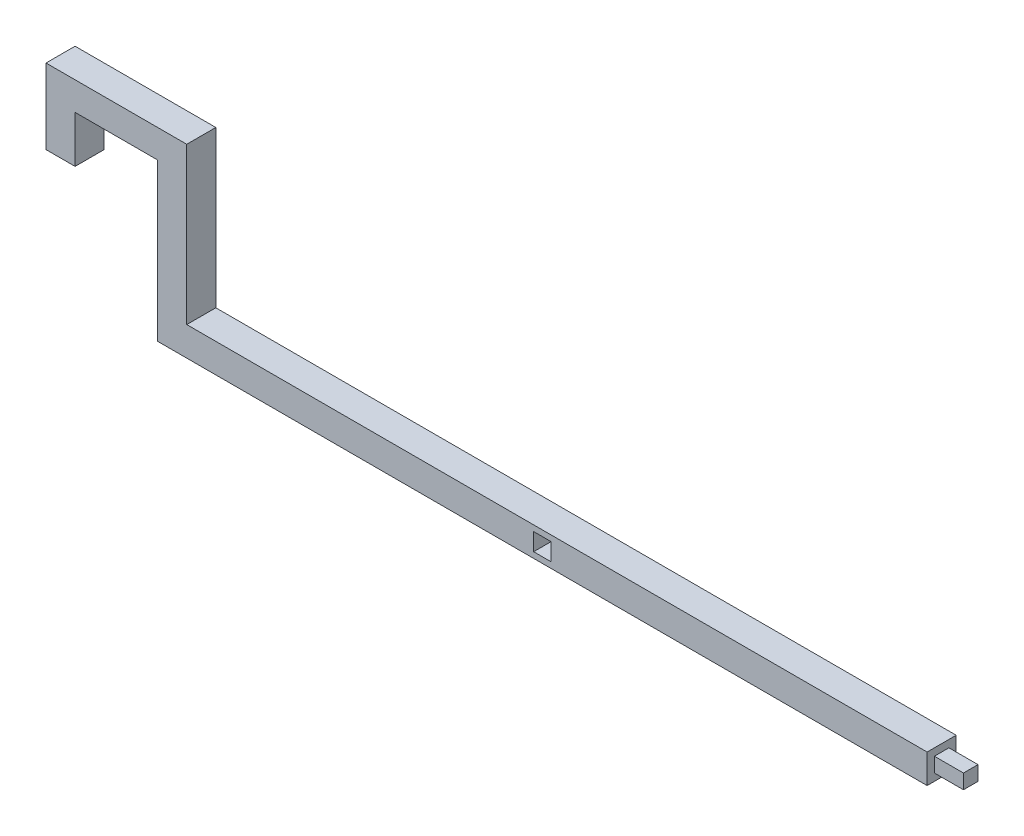
ISO-10303-21;
HEADER;
FILE_DESCRIPTION(('STEP AP214'),'2;1');
FILE_NAME('part.step','',(''),(''),'','','');
FILE_SCHEMA(('AUTOMOTIVE_DESIGN { 1 0 10303 214 1 1 1 1 }'));
ENDSEC;
DATA;
#1=APPLICATION_CONTEXT('core data for automotive mechanical design processes');
#2=APPLICATION_PROTOCOL_DEFINITION('international standard','automotive_design',2000,#1);
#3=PRODUCT_CONTEXT('',#1,'mechanical');
#4=PRODUCT('Part','Part','',(#3));
#5=PRODUCT_RELATED_PRODUCT_CATEGORY('part','',(#4));
#6=PRODUCT_DEFINITION_FORMATION('','',#4);
#7=PRODUCT_DEFINITION_CONTEXT('part definition',#1,'design');
#8=PRODUCT_DEFINITION('design','',#6,#7);
#9=PRODUCT_DEFINITION_SHAPE('','',#8);
#10=(LENGTH_UNIT() NAMED_UNIT(*) SI_UNIT(.MILLI.,.METRE.));
#11=(NAMED_UNIT(*) PLANE_ANGLE_UNIT() SI_UNIT($,.RADIAN.));
#12=(NAMED_UNIT(*) SI_UNIT($,.STERADIAN.) SOLID_ANGLE_UNIT());
#13=UNCERTAINTY_MEASURE_WITH_UNIT(LENGTH_MEASURE(1.E-05),#10,'distance_accuracy_value','');
#14=(GEOMETRIC_REPRESENTATION_CONTEXT(3) GLOBAL_UNCERTAINTY_ASSIGNED_CONTEXT((#13)) GLOBAL_UNIT_ASSIGNED_CONTEXT((#10,
#11,#12)) REPRESENTATION_CONTEXT('',''));
#15=CARTESIAN_POINT('',(0.,0.,0.));
#16=DIRECTION('',(0.,0.,1.));
#17=DIRECTION('',(1.,0.,0.));
#18=AXIS2_PLACEMENT_3D('',#15,#16,#17);
#19=CARTESIAN_POINT('',(146.5,-18.95,5.));
#20=DIRECTION('',(-1.,0.,0.));
#21=DIRECTION('',(0.,0.,1.));
#22=AXIS2_PLACEMENT_3D('',#19,#20,#21);
#23=PLANE('',#22);
#24=DIRECTION('',(0.,1.,0.));
#25=VECTOR('',#24,1.);
#26=CARTESIAN_POINT('',(146.5,-18.95,0.));
#27=LINE('',#26,#25);
#28=CARTESIAN_POINT('',(146.5,-18.95,0.));
#29=VERTEX_POINT('',#28);
#30=CARTESIAN_POINT('',(146.5,-13.95,0.));
#31=VERTEX_POINT('',#30);
#32=EDGE_CURVE('E249',#29,#31,#27,.T.);
#33=ORIENTED_EDGE('',*,*,#32,.T.);
#34=DIRECTION('',(0.,0.,-1.));
#35=VECTOR('',#34,1.);
#36=CARTESIAN_POINT('',(146.5,-13.95,5.));
#37=LINE('',#36,#35);
#38=CARTESIAN_POINT('',(146.5,-13.95,5.));
#39=VERTEX_POINT('',#38);
#40=EDGE_CURVE('E276',#39,#31,#37,.T.);
#41=ORIENTED_EDGE('',*,*,#40,.F.);
#42=DIRECTION('',(0.,1.,0.));
#43=VECTOR('',#42,1.);
#44=CARTESIAN_POINT('',(146.5,-18.95,5.));
#45=LINE('',#44,#43);
#46=CARTESIAN_POINT('',(146.5,-18.95,5.));
#47=VERTEX_POINT('',#46);
#48=EDGE_CURVE('E228',#47,#39,#45,.T.);
#49=ORIENTED_EDGE('',*,*,#48,.F.);
#50=DIRECTION('',(0.,0.,-1.));
#51=VECTOR('',#50,1.);
#52=CARTESIAN_POINT('',(146.5,-18.95,5.));
#53=LINE('',#52,#51);
#54=EDGE_CURVE('E279',#47,#29,#53,.T.);
#55=ORIENTED_EDGE('',*,*,#54,.T.);
#56=EDGE_LOOP('',(#33,#41,#49,#55));
#57=FACE_BOUND('',#56,.T.);
#58=DIRECTION('',(0.,-1.,0.));
#59=VECTOR('',#58,1.);
#60=CARTESIAN_POINT('',(146.5,-17.7,3.75));
#61=LINE('',#60,#59);
#62=CARTESIAN_POINT('',(146.5,-15.2,3.75));
#63=VERTEX_POINT('',#62);
#64=CARTESIAN_POINT('',(146.5,-17.7,3.75));
#65=VERTEX_POINT('',#64);
#66=EDGE_CURVE('E183',#63,#65,#61,.T.);
#67=ORIENTED_EDGE('',*,*,#66,.F.);
#68=DIRECTION('',(0.,0.,1.));
#69=VECTOR('',#68,1.);
#70=CARTESIAN_POINT('',(146.5,-15.2,3.75));
#71=LINE('',#70,#69);
#72=CARTESIAN_POINT('',(146.5,-15.2,1.25));
#73=VERTEX_POINT('',#72);
#74=EDGE_CURVE('E190',#73,#63,#71,.T.);
#75=ORIENTED_EDGE('',*,*,#74,.F.);
#76=DIRECTION('',(0.,1.,0.));
#77=VECTOR('',#76,1.);
#78=CARTESIAN_POINT('',(146.5,-17.7,1.25));
#79=LINE('',#78,#77);
#80=CARTESIAN_POINT('',(146.5,-17.7,1.25));
#81=VERTEX_POINT('',#80);
#82=EDGE_CURVE('E202',#81,#73,#79,.T.);
#83=ORIENTED_EDGE('',*,*,#82,.F.);
#84=DIRECTION('',(0.,0.,-1.));
#85=VECTOR('',#84,1.);
#86=CARTESIAN_POINT('',(146.5,-17.7,3.75));
#87=LINE('',#86,#85);
#88=EDGE_CURVE('E199',#65,#81,#87,.T.);
#89=ORIENTED_EDGE('',*,*,#88,.F.);
#90=EDGE_LOOP('',(#67,#75,#83,#89));
#91=FACE_BOUND('',#90,.T.);
#92=ADVANCED_FACE('F33',(#57,#91),#23,.F.);
#93=CARTESIAN_POINT('',(0.,6.7,5.));
#94=DIRECTION('',(-1.,0.,0.));
#95=DIRECTION('',(0.,0.,1.));
#96=AXIS2_PLACEMENT_3D('',#93,#94,#95);
#97=PLANE('',#96);
#98=DIRECTION('',(0.,1.,0.));
#99=VECTOR('',#98,1.);
#100=CARTESIAN_POINT('',(0.,6.7,0.));
#101=LINE('',#100,#99);
#102=CARTESIAN_POINT('',(0.,0.,0.));
#103=VERTEX_POINT('',#102);
#104=CARTESIAN_POINT('',(0.,8.05,0.));
#105=VERTEX_POINT('',#104);
#106=EDGE_CURVE('E218',#103,#105,#101,.T.);
#107=ORIENTED_EDGE('',*,*,#106,.T.);
#108=DIRECTION('',(0.,0.,-1.));
#109=VECTOR('',#108,1.);
#110=CARTESIAN_POINT('',(0.,8.05,5.));
#111=LINE('',#110,#109);
#112=CARTESIAN_POINT('',(0.,8.05,5.));
#113=VERTEX_POINT('',#112);
#114=EDGE_CURVE('E288',#113,#105,#111,.T.);
#115=ORIENTED_EDGE('',*,*,#114,.F.);
#116=DIRECTION('',(0.,1.,0.));
#117=VECTOR('',#116,1.);
#118=CARTESIAN_POINT('',(0.,6.7,5.));
#119=LINE('',#118,#117);
#120=CARTESIAN_POINT('',(0.,0.,5.));
#121=VERTEX_POINT('',#120);
#122=EDGE_CURVE('E219',#121,#113,#119,.T.);
#123=ORIENTED_EDGE('',*,*,#122,.F.);
#124=DIRECTION('',(0.,0.,-1.));
#125=VECTOR('',#124,1.);
#126=CARTESIAN_POINT('',(0.,0.,5.));
#127=LINE('',#126,#125);
#128=EDGE_CURVE('E240',#121,#103,#127,.T.);
#129=ORIENTED_EDGE('',*,*,#128,.T.);
#130=EDGE_LOOP('',(#107,#115,#123,#129));
#131=FACE_BOUND('',#130,.T.);
#132=ADVANCED_FACE('F35',(#131),#97,.F.);
#133=CARTESIAN_POINT('',(5.5,8.05,5.));
#134=DIRECTION('',(0.,1.,0.));
#135=DIRECTION('',(0.,0.,1.));
#136=AXIS2_PLACEMENT_3D('',#133,#134,#135);
#137=PLANE('',#136);
#138=DIRECTION('',(1.,0.,0.));
#139=VECTOR('',#138,1.);
#140=CARTESIAN_POINT('',(5.5,8.05,0.));
#141=LINE('',#140,#139);
#142=CARTESIAN_POINT('',(14.2,8.05,0.));
#143=VERTEX_POINT('',#142);
#144=EDGE_CURVE('E243',#105,#143,#141,.T.);
#145=ORIENTED_EDGE('',*,*,#144,.T.);
#146=DIRECTION('',(0.,0.,-1.));
#147=VECTOR('',#146,1.);
#148=CARTESIAN_POINT('',(14.2,8.05,5.));
#149=LINE('',#148,#147);
#150=CARTESIAN_POINT('',(14.2,8.05,5.));
#151=VERTEX_POINT('',#150);
#152=EDGE_CURVE('E285',#151,#143,#149,.T.);
#153=ORIENTED_EDGE('',*,*,#152,.F.);
#154=DIRECTION('',(1.,0.,0.));
#155=VECTOR('',#154,1.);
#156=CARTESIAN_POINT('',(0.,8.05,5.));
#157=LINE('',#156,#155);
#158=EDGE_CURVE('E221',#113,#151,#157,.T.);
#159=ORIENTED_EDGE('',*,*,#158,.F.);
#160=ORIENTED_EDGE('',*,*,#114,.T.);
#161=EDGE_LOOP('',(#145,#153,#159,#160));
#162=FACE_BOUND('',#161,.T.);
#163=ADVANCED_FACE('F322',(#162),#137,.F.);
#164=CARTESIAN_POINT('',(14.2,8.05,5.));
#165=DIRECTION('',(1.,0.,0.));
#166=DIRECTION('',(0.,1.,0.));
#167=AXIS2_PLACEMENT_3D('',#164,#165,#166);
#168=PLANE('',#167);
#169=DIRECTION('',(0.,-1.,0.));
#170=VECTOR('',#169,1.);
#171=CARTESIAN_POINT('',(14.2,8.05,0.));
#172=LINE('',#171,#170);
#173=CARTESIAN_POINT('',(14.2,-18.95,0.));
#174=VERTEX_POINT('',#173);
#175=EDGE_CURVE('E245',#143,#174,#172,.T.);
#176=ORIENTED_EDGE('',*,*,#175,.T.);
#177=DIRECTION('',(0.,0.,-1.));
#178=VECTOR('',#177,1.);
#179=CARTESIAN_POINT('',(14.2,-18.95,5.));
#180=LINE('',#179,#178);
#181=CARTESIAN_POINT('',(14.2,-18.95,5.));
#182=VERTEX_POINT('',#181);
#183=EDGE_CURVE('E282',#182,#174,#180,.T.);
#184=ORIENTED_EDGE('',*,*,#183,.F.);
#185=DIRECTION('',(0.,-1.,0.));
#186=VECTOR('',#185,1.);
#187=CARTESIAN_POINT('',(14.2,8.05,5.));
#188=LINE('',#187,#186);
#189=EDGE_CURVE('E224',#151,#182,#188,.T.);
#190=ORIENTED_EDGE('',*,*,#189,.F.);
#191=ORIENTED_EDGE('',*,*,#152,.T.);
#192=EDGE_LOOP('',(#176,#184,#190,#191));
#193=FACE_BOUND('',#192,.T.);
#194=ADVANCED_FACE('F332',(#193),#168,.F.);
#195=CARTESIAN_POINT('',(14.2,-18.95,5.));
#196=DIRECTION('',(0.,1.,0.));
#197=DIRECTION('',(-1.,0.,0.));
#198=AXIS2_PLACEMENT_3D('',#195,#196,#197);
#199=PLANE('',#198);
#200=DIRECTION('',(1.,0.,0.));
#201=VECTOR('',#200,1.);
#202=CARTESIAN_POINT('',(14.2,-18.95,0.));
#203=LINE('',#202,#201);
#204=EDGE_CURVE('E247',#174,#29,#203,.T.);
#205=ORIENTED_EDGE('',*,*,#204,.T.);
#206=ORIENTED_EDGE('',*,*,#54,.F.);
#207=DIRECTION('',(1.,0.,0.));
#208=VECTOR('',#207,1.);
#209=CARTESIAN_POINT('',(14.2,-18.95,5.));
#210=LINE('',#209,#208);
#211=EDGE_CURVE('E226',#182,#47,#210,.T.);
#212=ORIENTED_EDGE('',*,*,#211,.F.);
#213=ORIENTED_EDGE('',*,*,#183,.T.);
#214=EDGE_LOOP('',(#205,#206,#212,#213));
#215=FACE_BOUND('',#214,.T.);
#216=ADVANCED_FACE('F329',(#215),#199,.F.);
#217=CARTESIAN_POINT('',(19.2,-13.95,5.));
#218=DIRECTION('',(0.,-1.,0.));
#219=DIRECTION('',(0.,0.,-1.));
#220=AXIS2_PLACEMENT_3D('',#217,#218,#219);
#221=PLANE('',#220);
#222=DIRECTION('',(-1.,0.,0.));
#223=VECTOR('',#222,1.);
#224=CARTESIAN_POINT('',(19.2,-13.95,0.));
#225=LINE('',#224,#223);
#226=CARTESIAN_POINT('',(19.2,-13.95,0.));
#227=VERTEX_POINT('',#226);
#228=EDGE_CURVE('E251',#31,#227,#225,.T.);
#229=ORIENTED_EDGE('',*,*,#228,.T.);
#230=DIRECTION('',(0.,0.,-1.));
#231=VECTOR('',#230,1.);
#232=CARTESIAN_POINT('',(19.2,-13.95,5.));
#233=LINE('',#232,#231);
#234=CARTESIAN_POINT('',(19.2,-13.95,5.));
#235=VERTEX_POINT('',#234);
#236=EDGE_CURVE('E273',#235,#227,#233,.T.);
#237=ORIENTED_EDGE('',*,*,#236,.F.);
#238=DIRECTION('',(-1.,0.,0.));
#239=VECTOR('',#238,1.);
#240=CARTESIAN_POINT('',(19.2,-13.95,5.));
#241=LINE('',#240,#239);
#242=EDGE_CURVE('E230',#39,#235,#241,.T.);
#243=ORIENTED_EDGE('',*,*,#242,.F.);
#244=ORIENTED_EDGE('',*,*,#40,.T.);
#245=EDGE_LOOP('',(#229,#237,#243,#244));
#246=FACE_BOUND('',#245,.T.);
#247=ADVANCED_FACE('F327',(#246),#221,.F.);
#248=CARTESIAN_POINT('',(19.2,12.9,5.));
#249=DIRECTION('',(-1.,0.,0.));
#250=DIRECTION('',(0.,-1.,0.));
#251=AXIS2_PLACEMENT_3D('',#248,#249,#250);
#252=PLANE('',#251);
#253=DIRECTION('',(0.,1.,0.));
#254=VECTOR('',#253,1.);
#255=CARTESIAN_POINT('',(19.2,12.9,0.));
#256=LINE('',#255,#254);
#257=CARTESIAN_POINT('',(19.2,12.9,0.));
#258=VERTEX_POINT('',#257);
#259=EDGE_CURVE('E253',#227,#258,#256,.T.);
#260=ORIENTED_EDGE('',*,*,#259,.T.);
#261=DIRECTION('',(0.,0.,-1.));
#262=VECTOR('',#261,1.);
#263=CARTESIAN_POINT('',(19.2,12.9,5.));
#264=LINE('',#263,#262);
#265=CARTESIAN_POINT('',(19.2,12.9,5.));
#266=VERTEX_POINT('',#265);
#267=EDGE_CURVE('E270',#266,#258,#264,.T.);
#268=ORIENTED_EDGE('',*,*,#267,.F.);
#269=DIRECTION('',(0.,1.,0.));
#270=VECTOR('',#269,1.);
#271=CARTESIAN_POINT('',(19.2,12.9,5.));
#272=LINE('',#271,#270);
#273=EDGE_CURVE('E232',#235,#266,#272,.T.);
#274=ORIENTED_EDGE('',*,*,#273,.F.);
#275=ORIENTED_EDGE('',*,*,#236,.T.);
#276=EDGE_LOOP('',(#260,#268,#274,#275));
#277=FACE_BOUND('',#276,.T.);
#278=ADVANCED_FACE('F371',(#277),#252,.F.);
#279=CARTESIAN_POINT('',(-5.,12.9,5.));
#280=DIRECTION('',(0.,-1.,0.));
#281=DIRECTION('',(0.,0.,-1.));
#282=AXIS2_PLACEMENT_3D('',#279,#280,#281);
#283=PLANE('',#282);
#284=DIRECTION('',(-1.,0.,0.));
#285=VECTOR('',#284,1.);
#286=CARTESIAN_POINT('',(-5.,12.9,0.));
#287=LINE('',#286,#285);
#288=CARTESIAN_POINT('',(-5.,12.9,0.));
#289=VERTEX_POINT('',#288);
#290=EDGE_CURVE('E256',#258,#289,#287,.T.);
#291=ORIENTED_EDGE('',*,*,#290,.T.);
#292=DIRECTION('',(0.,0.,-1.));
#293=VECTOR('',#292,1.);
#294=CARTESIAN_POINT('',(-5.,12.9,5.));
#295=LINE('',#294,#293);
#296=CARTESIAN_POINT('',(-5.,12.9,5.));
#297=VERTEX_POINT('',#296);
#298=EDGE_CURVE('E267',#297,#289,#295,.T.);
#299=ORIENTED_EDGE('',*,*,#298,.F.);
#300=DIRECTION('',(-1.,0.,0.));
#301=VECTOR('',#300,1.);
#302=CARTESIAN_POINT('',(5.5,12.9,5.));
#303=LINE('',#302,#301);
#304=EDGE_CURVE('E234',#266,#297,#303,.T.);
#305=ORIENTED_EDGE('',*,*,#304,.F.);
#306=ORIENTED_EDGE('',*,*,#267,.T.);
#307=EDGE_LOOP('',(#291,#299,#305,#306));
#308=FACE_BOUND('',#307,.T.);
#309=ADVANCED_FACE('F374',(#308),#283,.F.);
#310=CARTESIAN_POINT('',(-5.,0.,5.));
#311=DIRECTION('',(1.,0.,0.));
#312=DIRECTION('',(0.,0.,-1.));
#313=AXIS2_PLACEMENT_3D('',#310,#311,#312);
#314=PLANE('',#313);
#315=DIRECTION('',(0.,-1.,0.));
#316=VECTOR('',#315,1.);
#317=CARTESIAN_POINT('',(-5.,0.,0.));
#318=LINE('',#317,#316);
#319=CARTESIAN_POINT('',(-5.,0.,0.));
#320=VERTEX_POINT('',#319);
#321=EDGE_CURVE('E258',#289,#320,#318,.T.);
#322=ORIENTED_EDGE('',*,*,#321,.T.);
#323=DIRECTION('',(0.,0.,-1.));
#324=VECTOR('',#323,1.);
#325=CARTESIAN_POINT('',(-5.,0.,5.));
#326=LINE('',#325,#324);
#327=CARTESIAN_POINT('',(-5.,0.,5.));
#328=VERTEX_POINT('',#327);
#329=EDGE_CURVE('E264',#328,#320,#326,.T.);
#330=ORIENTED_EDGE('',*,*,#329,.F.);
#331=DIRECTION('',(0.,-1.,0.));
#332=VECTOR('',#331,1.);
#333=CARTESIAN_POINT('',(-5.,0.,5.));
#334=LINE('',#333,#332);
#335=EDGE_CURVE('E236',#297,#328,#334,.T.);
#336=ORIENTED_EDGE('',*,*,#335,.F.);
#337=ORIENTED_EDGE('',*,*,#298,.T.);
#338=EDGE_LOOP('',(#322,#330,#336,#337));
#339=FACE_BOUND('',#338,.T.);
#340=ADVANCED_FACE('F365',(#339),#314,.F.);
#341=CARTESIAN_POINT('',(0.,0.,5.));
#342=DIRECTION('',(0.,1.,0.));
#343=DIRECTION('',(-1.,0.,0.));
#344=AXIS2_PLACEMENT_3D('',#341,#342,#343);
#345=PLANE('',#344);
#346=DIRECTION('',(1.,0.,0.));
#347=VECTOR('',#346,1.);
#348=CARTESIAN_POINT('',(0.,0.,0.));
#349=LINE('',#348,#347);
#350=EDGE_CURVE('E222',#320,#103,#349,.T.);
#351=ORIENTED_EDGE('',*,*,#350,.T.);
#352=ORIENTED_EDGE('',*,*,#128,.F.);
#353=DIRECTION('',(1.,0.,0.));
#354=VECTOR('',#353,1.);
#355=CARTESIAN_POINT('',(0.,0.,5.));
#356=LINE('',#355,#354);
#357=EDGE_CURVE('E238',#328,#121,#356,.T.);
#358=ORIENTED_EDGE('',*,*,#357,.F.);
#359=ORIENTED_EDGE('',*,*,#329,.T.);
#360=EDGE_LOOP('',(#351,#352,#358,#359));
#361=FACE_BOUND('',#360,.T.);
#362=ADVANCED_FACE('F361',(#361),#345,.F.);
#363=CARTESIAN_POINT('',(0.,0.,5.));
#364=DIRECTION('',(0.,0.,-1.));
#365=DIRECTION('',(-1.,0.,0.));
#366=AXIS2_PLACEMENT_3D('',#363,#364,#365);
#367=PLANE('',#366);
#368=DIRECTION('',(1.,0.,0.));
#369=VECTOR('',#368,1.);
#370=CARTESIAN_POINT('',(78.85,-17.95,5.));
#371=LINE('',#370,#369);
#372=CARTESIAN_POINT('',(78.85,-17.95,5.));
#373=VERTEX_POINT('',#372);
#374=CARTESIAN_POINT('',(81.85,-17.95,5.));
#375=VERTEX_POINT('',#374);
#376=EDGE_CURVE('E169',#373,#375,#371,.T.);
#377=ORIENTED_EDGE('',*,*,#376,.F.);
#378=DIRECTION('',(0.,-1.,0.));
#379=VECTOR('',#378,1.);
#380=CARTESIAN_POINT('',(78.85,-14.95,5.));
#381=LINE('',#380,#379);
#382=CARTESIAN_POINT('',(78.85,-14.95,5.));
#383=VERTEX_POINT('',#382);
#384=EDGE_CURVE('E48',#383,#373,#381,.T.);
#385=ORIENTED_EDGE('',*,*,#384,.F.);
#386=DIRECTION('',(-1.,0.,0.));
#387=VECTOR('',#386,1.);
#388=CARTESIAN_POINT('',(78.85,-14.95,5.));
#389=LINE('',#388,#387);
#390=CARTESIAN_POINT('',(81.85,-14.95,5.));
#391=VERTEX_POINT('',#390);
#392=EDGE_CURVE('E176',#391,#383,#389,.T.);
#393=ORIENTED_EDGE('',*,*,#392,.F.);
#394=DIRECTION('',(0.,1.,0.));
#395=VECTOR('',#394,1.);
#396=CARTESIAN_POINT('',(81.85,-14.95,5.));
#397=LINE('',#396,#395);
#398=EDGE_CURVE('E160',#375,#391,#397,.T.);
#399=ORIENTED_EDGE('',*,*,#398,.F.);
#400=EDGE_LOOP('',(#377,#385,#393,#399));
#401=FACE_BOUND('',#400,.T.);
#402=ORIENTED_EDGE('',*,*,#122,.T.);
#403=ORIENTED_EDGE('',*,*,#158,.T.);
#404=ORIENTED_EDGE('',*,*,#189,.T.);
#405=ORIENTED_EDGE('',*,*,#211,.T.);
#406=ORIENTED_EDGE('',*,*,#48,.T.);
#407=ORIENTED_EDGE('',*,*,#242,.T.);
#408=ORIENTED_EDGE('',*,*,#273,.T.);
#409=ORIENTED_EDGE('',*,*,#304,.T.);
#410=ORIENTED_EDGE('',*,*,#335,.T.);
#411=ORIENTED_EDGE('',*,*,#357,.T.);
#412=EDGE_LOOP('',(#402,#403,#404,#405,#406,#407,#408,#409,#410,#411));
#413=FACE_BOUND('',#412,.T.);
#414=ADVANCED_FACE('F173',(#401,#413),#367,.F.);
#415=CARTESIAN_POINT('',(0.,0.,0.));
#416=DIRECTION('',(0.,0.,-1.));
#417=DIRECTION('',(-1.,0.,0.));
#418=AXIS2_PLACEMENT_3D('',#415,#416,#417);
#419=PLANE('',#418);
#420=DIRECTION('',(0.,1.,0.));
#421=VECTOR('',#420,1.);
#422=CARTESIAN_POINT('',(78.85,0.,0.));
#423=LINE('',#422,#421);
#424=CARTESIAN_POINT('',(78.85,-17.95,0.));
#425=VERTEX_POINT('',#424);
#426=CARTESIAN_POINT('',(78.85,-14.95,0.));
#427=VERTEX_POINT('',#426);
#428=EDGE_CURVE('E11',#425,#427,#423,.T.);
#429=ORIENTED_EDGE('',*,*,#428,.F.);
#430=DIRECTION('',(-1.,0.,0.));
#431=VECTOR('',#430,1.);
#432=CARTESIAN_POINT('',(0.,-17.95,0.));
#433=LINE('',#432,#431);
#434=CARTESIAN_POINT('',(81.85,-17.95,0.));
#435=VERTEX_POINT('',#434);
#436=EDGE_CURVE('E291',#435,#425,#433,.T.);
#437=ORIENTED_EDGE('',*,*,#436,.F.);
#438=DIRECTION('',(0.,-1.,0.));
#439=VECTOR('',#438,1.);
#440=CARTESIAN_POINT('',(81.85,0.,0.));
#441=LINE('',#440,#439);
#442=CARTESIAN_POINT('',(81.85,-14.95,0.));
#443=VERTEX_POINT('',#442);
#444=EDGE_CURVE('E163',#443,#435,#441,.T.);
#445=ORIENTED_EDGE('',*,*,#444,.F.);
#446=DIRECTION('',(1.,0.,0.));
#447=VECTOR('',#446,1.);
#448=CARTESIAN_POINT('',(0.,-14.95,0.));
#449=LINE('',#448,#447);
#450=EDGE_CURVE('E41',#427,#443,#449,.T.);
#451=ORIENTED_EDGE('',*,*,#450,.F.);
#452=EDGE_LOOP('',(#429,#437,#445,#451));
#453=FACE_BOUND('',#452,.T.);
#454=ORIENTED_EDGE('',*,*,#106,.F.);
#455=ORIENTED_EDGE('',*,*,#350,.F.);
#456=ORIENTED_EDGE('',*,*,#321,.F.);
#457=ORIENTED_EDGE('',*,*,#290,.F.);
#458=ORIENTED_EDGE('',*,*,#259,.F.);
#459=ORIENTED_EDGE('',*,*,#228,.F.);
#460=ORIENTED_EDGE('',*,*,#32,.F.);
#461=ORIENTED_EDGE('',*,*,#204,.F.);
#462=ORIENTED_EDGE('',*,*,#175,.F.);
#463=ORIENTED_EDGE('',*,*,#144,.F.);
#464=EDGE_LOOP('',(#454,#455,#456,#457,#458,#459,#460,#461,#462,#463));
#465=FACE_BOUND('',#464,.T.);
#466=ADVANCED_FACE('F299',(#453,#465),#419,.T.);
#467=CARTESIAN_POINT('',(151.5,-17.7,3.75));
#468=DIRECTION('',(0.,0.,-1.));
#469=DIRECTION('',(-1.,0.,0.));
#470=AXIS2_PLACEMENT_3D('',#467,#468,#469);
#471=PLANE('',#470);
#472=ORIENTED_EDGE('',*,*,#66,.T.);
#473=DIRECTION('',(-1.,0.,0.));
#474=VECTOR('',#473,1.);
#475=CARTESIAN_POINT('',(151.5,-17.7,3.75));
#476=LINE('',#475,#474);
#477=CARTESIAN_POINT('',(151.5,-17.7,3.75));
#478=VERTEX_POINT('',#477);
#479=EDGE_CURVE('E215',#478,#65,#476,.T.);
#480=ORIENTED_EDGE('',*,*,#479,.F.);
#481=DIRECTION('',(0.,-1.,0.));
#482=VECTOR('',#481,1.);
#483=CARTESIAN_POINT('',(151.5,-17.7,3.75));
#484=LINE('',#483,#482);
#485=CARTESIAN_POINT('',(151.5,-15.2,3.75));
#486=VERTEX_POINT('',#485);
#487=EDGE_CURVE('E186',#486,#478,#484,.T.);
#488=ORIENTED_EDGE('',*,*,#487,.F.);
#489=DIRECTION('',(-1.,0.,0.));
#490=VECTOR('',#489,1.);
#491=CARTESIAN_POINT('',(151.5,-15.2,3.75));
#492=LINE('',#491,#490);
#493=EDGE_CURVE('E196',#486,#63,#492,.T.);
#494=ORIENTED_EDGE('',*,*,#493,.T.);
#495=EDGE_LOOP('',(#472,#480,#488,#494));
#496=FACE_BOUND('',#495,.T.);
#497=ADVANCED_FACE('F387',(#496),#471,.F.);
#498=CARTESIAN_POINT('',(151.5,-17.7,3.75));
#499=DIRECTION('',(0.,1.,0.));
#500=DIRECTION('',(0.,0.,1.));
#501=AXIS2_PLACEMENT_3D('',#498,#499,#500);
#502=PLANE('',#501);
#503=ORIENTED_EDGE('',*,*,#88,.T.);
#504=DIRECTION('',(-1.,0.,0.));
#505=VECTOR('',#504,1.);
#506=CARTESIAN_POINT('',(151.5,-17.7,1.25));
#507=LINE('',#506,#505);
#508=CARTESIAN_POINT('',(151.5,-17.7,1.25));
#509=VERTEX_POINT('',#508);
#510=EDGE_CURVE('E212',#509,#81,#507,.T.);
#511=ORIENTED_EDGE('',*,*,#510,.F.);
#512=DIRECTION('',(0.,0.,-1.));
#513=VECTOR('',#512,1.);
#514=CARTESIAN_POINT('',(151.5,-17.7,3.75));
#515=LINE('',#514,#513);
#516=EDGE_CURVE('E189',#478,#509,#515,.T.);
#517=ORIENTED_EDGE('',*,*,#516,.F.);
#518=ORIENTED_EDGE('',*,*,#479,.T.);
#519=EDGE_LOOP('',(#503,#511,#517,#518));
#520=FACE_BOUND('',#519,.T.);
#521=ADVANCED_FACE('F392',(#520),#502,.F.);
#522=CARTESIAN_POINT('',(151.5,-17.7,1.25));
#523=DIRECTION('',(0.,0.,1.));
#524=DIRECTION('',(1.,0.,0.));
#525=AXIS2_PLACEMENT_3D('',#522,#523,#524);
#526=PLANE('',#525);
#527=ORIENTED_EDGE('',*,*,#82,.T.);
#528=DIRECTION('',(-1.,0.,0.));
#529=VECTOR('',#528,1.);
#530=CARTESIAN_POINT('',(151.5,-15.2,1.25));
#531=LINE('',#530,#529);
#532=CARTESIAN_POINT('',(151.5,-15.2,1.25));
#533=VERTEX_POINT('',#532);
#534=EDGE_CURVE('E209',#533,#73,#531,.T.);
#535=ORIENTED_EDGE('',*,*,#534,.F.);
#536=DIRECTION('',(0.,1.,0.));
#537=VECTOR('',#536,1.);
#538=CARTESIAN_POINT('',(151.5,-17.7,1.25));
#539=LINE('',#538,#537);
#540=EDGE_CURVE('E192',#509,#533,#539,.T.);
#541=ORIENTED_EDGE('',*,*,#540,.F.);
#542=ORIENTED_EDGE('',*,*,#510,.T.);
#543=EDGE_LOOP('',(#527,#535,#541,#542));
#544=FACE_BOUND('',#543,.T.);
#545=ADVANCED_FACE('F396',(#544),#526,.F.);
#546=CARTESIAN_POINT('',(151.5,-15.2,3.75));
#547=DIRECTION('',(0.,-1.,0.));
#548=DIRECTION('',(0.,0.,-1.));
#549=AXIS2_PLACEMENT_3D('',#546,#547,#548);
#550=PLANE('',#549);
#551=ORIENTED_EDGE('',*,*,#74,.T.);
#552=ORIENTED_EDGE('',*,*,#493,.F.);
#553=DIRECTION('',(0.,0.,1.));
#554=VECTOR('',#553,1.);
#555=CARTESIAN_POINT('',(151.5,-15.2,3.75));
#556=LINE('',#555,#554);
#557=EDGE_CURVE('E194',#533,#486,#556,.T.);
#558=ORIENTED_EDGE('',*,*,#557,.F.);
#559=ORIENTED_EDGE('',*,*,#534,.T.);
#560=EDGE_LOOP('',(#551,#552,#558,#559));
#561=FACE_BOUND('',#560,.T.);
#562=ADVANCED_FACE('F310',(#561),#550,.F.);
#563=CARTESIAN_POINT('',(151.5,0.,0.));
#564=DIRECTION('',(-1.,0.,0.));
#565=DIRECTION('',(0.,0.,1.));
#566=AXIS2_PLACEMENT_3D('',#563,#564,#565);
#567=PLANE('',#566);
#568=ORIENTED_EDGE('',*,*,#487,.T.);
#569=ORIENTED_EDGE('',*,*,#516,.T.);
#570=ORIENTED_EDGE('',*,*,#540,.T.);
#571=ORIENTED_EDGE('',*,*,#557,.T.);
#572=EDGE_LOOP('',(#568,#569,#570,#571));
#573=FACE_BOUND('',#572,.T.);
#574=ADVANCED_FACE('F303',(#573),#567,.F.);
#575=CARTESIAN_POINT('',(78.85,-14.95,-16.));
#576=DIRECTION('',(-1.,0.,0.));
#577=DIRECTION('',(0.,0.,1.));
#578=AXIS2_PLACEMENT_3D('',#575,#576,#577);
#579=PLANE('',#578);
#580=ORIENTED_EDGE('',*,*,#428,.T.);
#581=DIRECTION('',(0.,0.,1.));
#582=VECTOR('',#581,1.);
#583=CARTESIAN_POINT('',(78.85,-14.95,-16.));
#584=LINE('',#583,#582);
#585=EDGE_CURVE('E181',#427,#383,#584,.T.);
#586=ORIENTED_EDGE('',*,*,#585,.T.);
#587=ORIENTED_EDGE('',*,*,#384,.T.);
#588=DIRECTION('',(0.,0.,1.));
#589=VECTOR('',#588,1.);
#590=CARTESIAN_POINT('',(78.85,-17.95,-16.));
#591=LINE('',#590,#589);
#592=EDGE_CURVE('E166',#425,#373,#591,.T.);
#593=ORIENTED_EDGE('',*,*,#592,.F.);
#594=EDGE_LOOP('',(#580,#586,#587,#593));
#595=FACE_BOUND('',#594,.T.);
#596=ADVANCED_FACE('F301',(#595),#579,.F.);
#597=CARTESIAN_POINT('',(78.85,-14.95,-16.));
#598=DIRECTION('',(0.,1.,0.));
#599=DIRECTION('',(0.,0.,1.));
#600=AXIS2_PLACEMENT_3D('',#597,#598,#599);
#601=PLANE('',#600);
#602=ORIENTED_EDGE('',*,*,#450,.T.);
#603=DIRECTION('',(0.,0.,1.));
#604=VECTOR('',#603,1.);
#605=CARTESIAN_POINT('',(81.85,-14.95,-16.));
#606=LINE('',#605,#604);
#607=EDGE_CURVE('E165',#443,#391,#606,.T.);
#608=ORIENTED_EDGE('',*,*,#607,.T.);
#609=ORIENTED_EDGE('',*,*,#392,.T.);
#610=ORIENTED_EDGE('',*,*,#585,.F.);
#611=EDGE_LOOP('',(#602,#608,#609,#610));
#612=FACE_BOUND('',#611,.T.);
#613=ADVANCED_FACE('F296',(#612),#601,.F.);
#614=CARTESIAN_POINT('',(81.85,-14.95,-16.));
#615=DIRECTION('',(1.,0.,0.));
#616=DIRECTION('',(0.,0.,-1.));
#617=AXIS2_PLACEMENT_3D('',#614,#615,#616);
#618=PLANE('',#617);
#619=ORIENTED_EDGE('',*,*,#444,.T.);
#620=DIRECTION('',(0.,0.,1.));
#621=VECTOR('',#620,1.);
#622=CARTESIAN_POINT('',(81.85,-17.95,-16.));
#623=LINE('',#622,#621);
#624=EDGE_CURVE('E56',#435,#375,#623,.T.);
#625=ORIENTED_EDGE('',*,*,#624,.T.);
#626=ORIENTED_EDGE('',*,*,#398,.T.);
#627=ORIENTED_EDGE('',*,*,#607,.F.);
#628=EDGE_LOOP('',(#619,#625,#626,#627));
#629=FACE_BOUND('',#628,.T.);
#630=ADVANCED_FACE('F157',(#629),#618,.F.);
#631=CARTESIAN_POINT('',(78.85,-17.95,-16.));
#632=DIRECTION('',(0.,-1.,0.));
#633=DIRECTION('',(0.,0.,-1.));
#634=AXIS2_PLACEMENT_3D('',#631,#632,#633);
#635=PLANE('',#634);
#636=ORIENTED_EDGE('',*,*,#436,.T.);
#637=ORIENTED_EDGE('',*,*,#592,.T.);
#638=ORIENTED_EDGE('',*,*,#376,.T.);
#639=ORIENTED_EDGE('',*,*,#624,.F.);
#640=EDGE_LOOP('',(#636,#637,#638,#639));
#641=FACE_BOUND('',#640,.T.);
#642=ADVANCED_FACE('F170',(#641),#635,.F.);
#643=CLOSED_SHELL('',(#92,#132,#163,#194,#216,#247,#278,#309,#340,#362,#414,#466,#497,#521,#545,
#562,#574,#596,#613,#630,#642));
#644=MANIFOLD_SOLID_BREP('B2',#643);
#645=ADVANCED_BREP_SHAPE_REPRESENTATION('',(#18,#644),#14);
#646=SHAPE_DEFINITION_REPRESENTATION(#9,#645);
ENDSEC;
END-ISO-10303-21;
